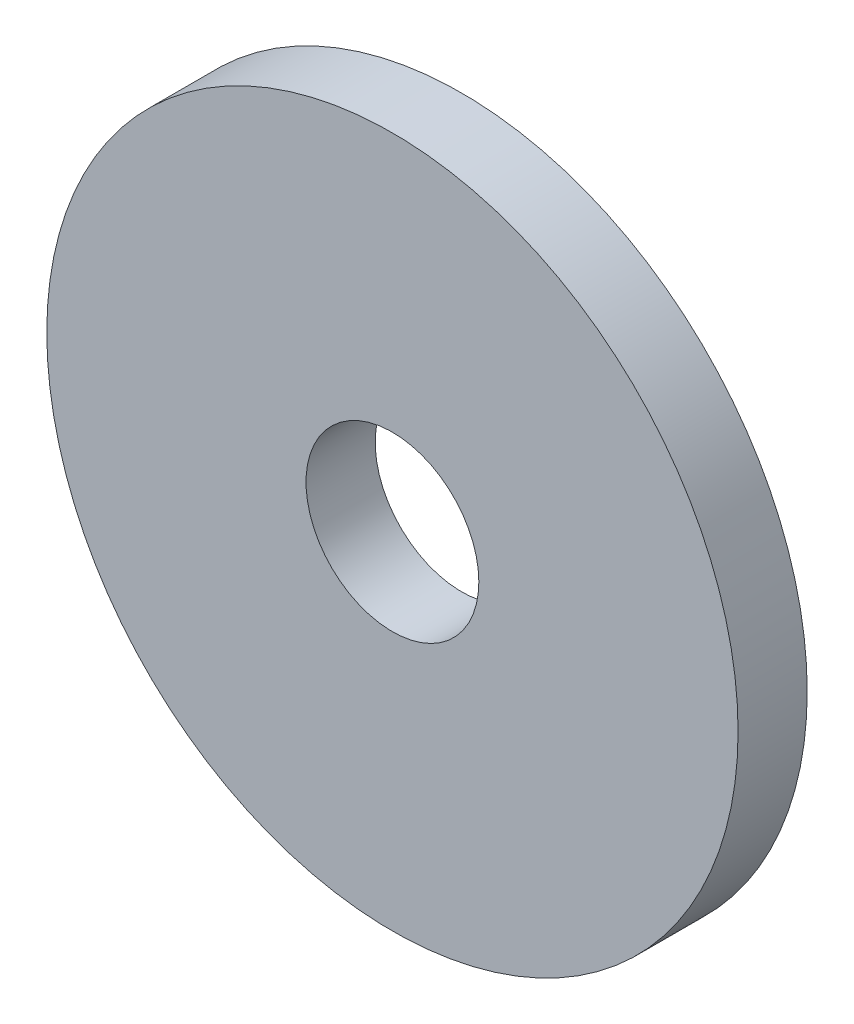
ISO-10303-21;
HEADER;
FILE_DESCRIPTION(('STEP AP214'),'2;1');
FILE_NAME('part.step','',(''),(''),'','','');
FILE_SCHEMA(('AUTOMOTIVE_DESIGN { 1 0 10303 214 1 1 1 1 }'));
ENDSEC;
DATA;
#1=APPLICATION_CONTEXT('core data for automotive mechanical design processes');
#2=APPLICATION_PROTOCOL_DEFINITION('international standard','automotive_design',2000,#1);
#3=PRODUCT_CONTEXT('',#1,'mechanical');
#4=PRODUCT('Part','Part','',(#3));
#5=PRODUCT_RELATED_PRODUCT_CATEGORY('part','',(#4));
#6=PRODUCT_DEFINITION_FORMATION('','',#4);
#7=PRODUCT_DEFINITION_CONTEXT('part definition',#1,'design');
#8=PRODUCT_DEFINITION('design','',#6,#7);
#9=PRODUCT_DEFINITION_SHAPE('','',#8);
#10=(LENGTH_UNIT() NAMED_UNIT(*) SI_UNIT(.MILLI.,.METRE.));
#11=(NAMED_UNIT(*) PLANE_ANGLE_UNIT() SI_UNIT($,.RADIAN.));
#12=(NAMED_UNIT(*) SI_UNIT($,.STERADIAN.) SOLID_ANGLE_UNIT());
#13=UNCERTAINTY_MEASURE_WITH_UNIT(LENGTH_MEASURE(1.E-05),#10,'distance_accuracy_value','');
#14=(GEOMETRIC_REPRESENTATION_CONTEXT(3) GLOBAL_UNCERTAINTY_ASSIGNED_CONTEXT((#13)) GLOBAL_UNIT_ASSIGNED_CONTEXT((#10,
#11,#12)) REPRESENTATION_CONTEXT('',''));
#15=CARTESIAN_POINT('',(0.,0.,0.));
#16=DIRECTION('',(0.,0.,1.));
#17=DIRECTION('',(1.,0.,0.));
#18=AXIS2_PLACEMENT_3D('',#15,#16,#17);
#19=CARTESIAN_POINT('',(0.,0.,2.));
#20=DIRECTION('',(0.,0.,-1.));
#21=DIRECTION('',(-1.,0.,0.));
#22=AXIS2_PLACEMENT_3D('',#19,#20,#21);
#23=CYLINDRICAL_SURFACE('',#22,10.);
#24=CARTESIAN_POINT('',(0.,0.,2.));
#25=DIRECTION('',(0.,0.,1.));
#26=DIRECTION('',(1.,0.,0.));
#27=AXIS2_PLACEMENT_3D('',#24,#25,#26);
#28=CIRCLE('',#27,10.);
#29=CARTESIAN_POINT('',(10.,0.,2.));
#30=VERTEX_POINT('',#29);
#31=EDGE_CURVE('E10',#30,#30,#28,.T.);
#32=ORIENTED_EDGE('',*,*,#31,.F.);
#33=EDGE_LOOP('',(#32));
#34=FACE_BOUND('',#33,.T.);
#35=CARTESIAN_POINT('',(0.,0.,0.));
#36=DIRECTION('',(0.,0.,1.));
#37=DIRECTION('',(1.,0.,0.));
#38=AXIS2_PLACEMENT_3D('',#35,#36,#37);
#39=CIRCLE('',#38,10.);
#40=CARTESIAN_POINT('',(10.,0.,0.));
#41=VERTEX_POINT('',#40);
#42=EDGE_CURVE('E38',#41,#41,#39,.T.);
#43=ORIENTED_EDGE('',*,*,#42,.T.);
#44=EDGE_LOOP('',(#43));
#45=FACE_BOUND('',#44,.T.);
#46=ADVANCED_FACE('F31',(#34,#45),#23,.T.);
#47=CARTESIAN_POINT('',(0.,0.,2.));
#48=DIRECTION('',(0.,0.,1.));
#49=DIRECTION('',(1.,0.,0.));
#50=AXIS2_PLACEMENT_3D('',#47,#48,#49);
#51=PLANE('',#50);
#52=CARTESIAN_POINT('',(0.,0.,2.));
#53=DIRECTION('',(0.,0.,1.));
#54=DIRECTION('',(1.,0.,0.));
#55=AXIS2_PLACEMENT_3D('',#52,#53,#54);
#56=CIRCLE('',#55,2.5);
#57=CARTESIAN_POINT('',(2.5,0.,2.));
#58=VERTEX_POINT('',#57);
#59=EDGE_CURVE('E44',#58,#58,#56,.T.);
#60=ORIENTED_EDGE('',*,*,#59,.F.);
#61=EDGE_LOOP('',(#60));
#62=FACE_BOUND('',#61,.T.);
#63=ORIENTED_EDGE('',*,*,#31,.T.);
#64=EDGE_LOOP('',(#63));
#65=FACE_BOUND('',#64,.T.);
#66=ADVANCED_FACE('F60',(#62,#65),#51,.T.);
#67=CARTESIAN_POINT('',(0.,0.,0.));
#68=DIRECTION('',(0.,0.,1.));
#69=DIRECTION('',(1.,0.,0.));
#70=AXIS2_PLACEMENT_3D('',#67,#68,#69);
#71=PLANE('',#70);
#72=CARTESIAN_POINT('',(0.,0.,0.));
#73=DIRECTION('',(0.,0.,1.));
#74=DIRECTION('',(1.,0.,0.));
#75=AXIS2_PLACEMENT_3D('',#72,#73,#74);
#76=CIRCLE('',#75,2.5);
#77=CARTESIAN_POINT('',(2.5,0.,0.));
#78=VERTEX_POINT('',#77);
#79=EDGE_CURVE('E34',#78,#78,#76,.T.);
#80=ORIENTED_EDGE('',*,*,#79,.T.);
#81=EDGE_LOOP('',(#80));
#82=FACE_BOUND('',#81,.T.);
#83=ORIENTED_EDGE('',*,*,#42,.F.);
#84=EDGE_LOOP('',(#83));
#85=FACE_BOUND('',#84,.T.);
#86=ADVANCED_FACE('F51',(#82,#85),#71,.F.);
#87=CARTESIAN_POINT('',(0.,0.,-2.));
#88=DIRECTION('',(0.,0.,1.));
#89=DIRECTION('',(1.,0.,0.));
#90=AXIS2_PLACEMENT_3D('',#87,#88,#89);
#91=CYLINDRICAL_SURFACE('',#90,2.5);
#92=ORIENTED_EDGE('',*,*,#59,.T.);
#93=EDGE_LOOP('',(#92));
#94=FACE_BOUND('',#93,.T.);
#95=ORIENTED_EDGE('',*,*,#79,.F.);
#96=EDGE_LOOP('',(#95));
#97=FACE_BOUND('',#96,.T.);
#98=ADVANCED_FACE('F54',(#94,#97),#91,.F.);
#99=CLOSED_SHELL('',(#46,#66,#86,#98));
#100=MANIFOLD_SOLID_BREP('B2',#99);
#101=ADVANCED_BREP_SHAPE_REPRESENTATION('',(#18,#100),#14);
#102=SHAPE_DEFINITION_REPRESENTATION(#9,#101);
ENDSEC;
END-ISO-10303-21;
